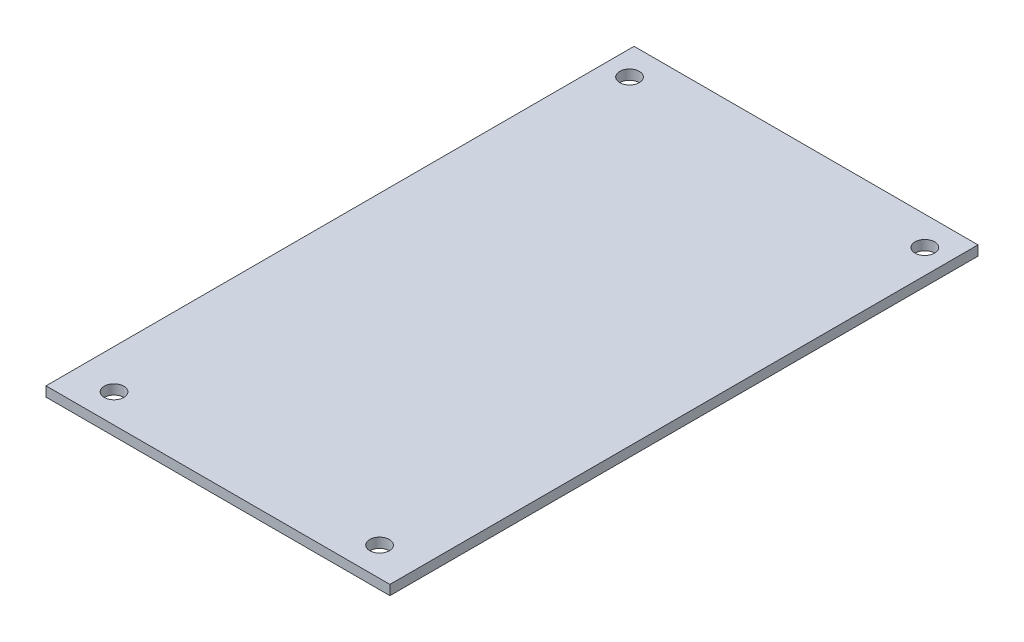
ISO-10303-21;
HEADER;
FILE_DESCRIPTION(('STEP AP214'),'2;1');
FILE_NAME('part.step','',(''),(''),'','','');
FILE_SCHEMA(('AUTOMOTIVE_DESIGN { 1 0 10303 214 1 1 1 1 }'));
ENDSEC;
DATA;
#1=APPLICATION_CONTEXT('core data for automotive mechanical design processes');
#2=APPLICATION_PROTOCOL_DEFINITION('international standard','automotive_design',2000,#1);
#3=PRODUCT_CONTEXT('',#1,'mechanical');
#4=PRODUCT('Part','Part','',(#3));
#5=PRODUCT_RELATED_PRODUCT_CATEGORY('part','',(#4));
#6=PRODUCT_DEFINITION_FORMATION('','',#4);
#7=PRODUCT_DEFINITION_CONTEXT('part definition',#1,'design');
#8=PRODUCT_DEFINITION('design','',#6,#7);
#9=PRODUCT_DEFINITION_SHAPE('','',#8);
#10=(LENGTH_UNIT() NAMED_UNIT(*) SI_UNIT(.MILLI.,.METRE.));
#11=(NAMED_UNIT(*) PLANE_ANGLE_UNIT() SI_UNIT($,.RADIAN.));
#12=(NAMED_UNIT(*) SI_UNIT($,.STERADIAN.) SOLID_ANGLE_UNIT());
#13=UNCERTAINTY_MEASURE_WITH_UNIT(LENGTH_MEASURE(1.E-05),#10,'distance_accuracy_value','');
#14=(GEOMETRIC_REPRESENTATION_CONTEXT(3) GLOBAL_UNCERTAINTY_ASSIGNED_CONTEXT((#13)) GLOBAL_UNIT_ASSIGNED_CONTEXT((#10,
#11,#12)) REPRESENTATION_CONTEXT('',''));
#15=CARTESIAN_POINT('',(0.,0.,0.));
#16=DIRECTION('',(0.,0.,1.));
#17=DIRECTION('',(1.,0.,0.));
#18=AXIS2_PLACEMENT_3D('',#15,#16,#17);
#19=CARTESIAN_POINT('',(0.,1.5875,0.));
#20=DIRECTION('',(1.,0.,0.));
#21=DIRECTION('',(0.,0.,-1.));
#22=AXIS2_PLACEMENT_3D('',#19,#20,#21);
#23=PLANE('',#22);
#24=DIRECTION('',(0.,0.,1.));
#25=VECTOR('',#24,1.);
#26=CARTESIAN_POINT('',(0.,0.,0.));
#27=LINE('',#26,#25);
#28=CARTESIAN_POINT('',(0.,0.,-95.25));
#29=VERTEX_POINT('',#28);
#30=CARTESIAN_POINT('',(0.,0.,0.));
#31=VERTEX_POINT('',#30);
#32=EDGE_CURVE('E96',#29,#31,#27,.T.);
#33=ORIENTED_EDGE('',*,*,#32,.T.);
#34=DIRECTION('',(0.,-1.,0.));
#35=VECTOR('',#34,1.);
#36=CARTESIAN_POINT('',(0.,1.5875,0.));
#37=LINE('',#36,#35);
#38=CARTESIAN_POINT('',(0.,1.5875,0.));
#39=VERTEX_POINT('',#38);
#40=EDGE_CURVE('E11',#39,#31,#37,.T.);
#41=ORIENTED_EDGE('',*,*,#40,.F.);
#42=DIRECTION('',(0.,0.,1.));
#43=VECTOR('',#42,1.);
#44=CARTESIAN_POINT('',(0.,1.5875,0.));
#45=LINE('',#44,#43);
#46=CARTESIAN_POINT('',(0.,1.5875,-95.25));
#47=VERTEX_POINT('',#46);
#48=EDGE_CURVE('E84',#47,#39,#45,.T.);
#49=ORIENTED_EDGE('',*,*,#48,.F.);
#50=DIRECTION('',(0.,-1.,0.));
#51=VECTOR('',#50,1.);
#52=CARTESIAN_POINT('',(0.,1.5875,-95.25));
#53=LINE('',#52,#51);
#54=EDGE_CURVE('E92',#47,#29,#53,.T.);
#55=ORIENTED_EDGE('',*,*,#54,.T.);
#56=EDGE_LOOP('',(#33,#41,#49,#55));
#57=FACE_BOUND('',#56,.T.);
#58=ADVANCED_FACE('F33',(#57),#23,.F.);
#59=CARTESIAN_POINT('',(0.,1.5875,0.));
#60=DIRECTION('',(0.,0.,-1.));
#61=DIRECTION('',(-1.,0.,0.));
#62=AXIS2_PLACEMENT_3D('',#59,#60,#61);
#63=PLANE('',#62);
#64=DIRECTION('',(1.,0.,0.));
#65=VECTOR('',#64,1.);
#66=CARTESIAN_POINT('',(0.,0.,0.));
#67=LINE('',#66,#65);
#68=CARTESIAN_POINT('',(55.7022,0.,0.));
#69=VERTEX_POINT('',#68);
#70=EDGE_CURVE('E88',#31,#69,#67,.T.);
#71=ORIENTED_EDGE('',*,*,#70,.T.);
#72=DIRECTION('',(0.,-1.,0.));
#73=VECTOR('',#72,1.);
#74=CARTESIAN_POINT('',(55.7022,1.5875,0.));
#75=LINE('',#74,#73);
#76=CARTESIAN_POINT('',(55.7022,1.5875,0.));
#77=VERTEX_POINT('',#76);
#78=EDGE_CURVE('E41',#77,#69,#75,.T.);
#79=ORIENTED_EDGE('',*,*,#78,.F.);
#80=DIRECTION('',(1.,0.,0.));
#81=VECTOR('',#80,1.);
#82=CARTESIAN_POINT('',(0.,1.5875,0.));
#83=LINE('',#82,#81);
#84=EDGE_CURVE('E79',#39,#77,#83,.T.);
#85=ORIENTED_EDGE('',*,*,#84,.F.);
#86=ORIENTED_EDGE('',*,*,#40,.T.);
#87=EDGE_LOOP('',(#71,#79,#85,#86));
#88=FACE_BOUND('',#87,.T.);
#89=ADVANCED_FACE('F87',(#88),#63,.F.);
#90=CARTESIAN_POINT('',(55.7022,1.5875,0.));
#91=DIRECTION('',(-1.,0.,0.));
#92=DIRECTION('',(0.,0.,1.));
#93=AXIS2_PLACEMENT_3D('',#90,#91,#92);
#94=PLANE('',#93);
#95=DIRECTION('',(0.,0.,-1.));
#96=VECTOR('',#95,1.);
#97=CARTESIAN_POINT('',(55.7022,0.,0.));
#98=LINE('',#97,#96);
#99=CARTESIAN_POINT('',(55.7022,0.,-95.25));
#100=VERTEX_POINT('',#99);
#101=EDGE_CURVE('E66',#69,#100,#98,.T.);
#102=ORIENTED_EDGE('',*,*,#101,.T.);
#103=DIRECTION('',(0.,-1.,0.));
#104=VECTOR('',#103,1.);
#105=CARTESIAN_POINT('',(55.7022,1.5875,-95.25));
#106=LINE('',#105,#104);
#107=CARTESIAN_POINT('',(55.7022,1.5875,-95.25));
#108=VERTEX_POINT('',#107);
#109=EDGE_CURVE('E89',#108,#100,#106,.T.);
#110=ORIENTED_EDGE('',*,*,#109,.F.);
#111=DIRECTION('',(0.,0.,-1.));
#112=VECTOR('',#111,1.);
#113=CARTESIAN_POINT('',(55.7022,1.5875,0.));
#114=LINE('',#113,#112);
#115=EDGE_CURVE('E82',#77,#108,#114,.T.);
#116=ORIENTED_EDGE('',*,*,#115,.F.);
#117=ORIENTED_EDGE('',*,*,#78,.T.);
#118=EDGE_LOOP('',(#102,#110,#116,#117));
#119=FACE_BOUND('',#118,.T.);
#120=ADVANCED_FACE('F90',(#119),#94,.F.);
#121=CARTESIAN_POINT('',(0.,1.5875,-95.25));
#122=DIRECTION('',(0.,0.,1.));
#123=DIRECTION('',(1.,0.,0.));
#124=AXIS2_PLACEMENT_3D('',#121,#122,#123);
#125=PLANE('',#124);
#126=DIRECTION('',(-1.,0.,0.));
#127=VECTOR('',#126,1.);
#128=CARTESIAN_POINT('',(0.,0.,-95.25));
#129=LINE('',#128,#127);
#130=EDGE_CURVE('E72',#100,#29,#129,.T.);
#131=ORIENTED_EDGE('',*,*,#130,.T.);
#132=ORIENTED_EDGE('',*,*,#54,.F.);
#133=DIRECTION('',(-1.,0.,0.));
#134=VECTOR('',#133,1.);
#135=CARTESIAN_POINT('',(0.,1.5875,-95.25));
#136=LINE('',#135,#134);
#137=EDGE_CURVE('E49',#108,#47,#136,.T.);
#138=ORIENTED_EDGE('',*,*,#137,.F.);
#139=ORIENTED_EDGE('',*,*,#109,.T.);
#140=EDGE_LOOP('',(#131,#132,#138,#139));
#141=FACE_BOUND('',#140,.T.);
#142=ADVANCED_FACE('F104',(#141),#125,.F.);
#143=CARTESIAN_POINT('',(0.,1.5875,0.));
#144=DIRECTION('',(0.,-1.,0.));
#145=DIRECTION('',(0.,0.,-1.));
#146=AXIS2_PLACEMENT_3D('',#143,#144,#145);
#147=PLANE('',#146);
#148=CARTESIAN_POINT('',(51.7652,1.5875,-90.5764));
#149=DIRECTION('',(0.,1.,0.));
#150=DIRECTION('',(0.,0.,1.));
#151=AXIS2_PLACEMENT_3D('',#148,#149,#150);
#152=CIRCLE('',#151,1.5875);
#153=CARTESIAN_POINT('',(51.7652,1.5875,-88.9889));
#154=VERTEX_POINT('',#153);
#155=EDGE_CURVE('E123',#154,#154,#152,.T.);
#156=ORIENTED_EDGE('',*,*,#155,.F.);
#157=EDGE_LOOP('',(#156));
#158=FACE_BOUND('',#157,.T.);
#159=CARTESIAN_POINT('',(6.35,1.5875,-4.6736));
#160=DIRECTION('',(0.,1.,0.));
#161=DIRECTION('',(0.,0.,1.));
#162=AXIS2_PLACEMENT_3D('',#159,#160,#161);
#163=CIRCLE('',#162,1.5875);
#164=CARTESIAN_POINT('',(6.35,1.5875,-3.0861));
#165=VERTEX_POINT('',#164);
#166=EDGE_CURVE('E116',#165,#165,#163,.T.);
#167=ORIENTED_EDGE('',*,*,#166,.F.);
#168=EDGE_LOOP('',(#167));
#169=FACE_BOUND('',#168,.T.);
#170=CARTESIAN_POINT('',(49.3522,1.5875,-4.6736));
#171=DIRECTION('',(0.,1.,0.));
#172=DIRECTION('',(0.,0.,1.));
#173=AXIS2_PLACEMENT_3D('',#170,#171,#172);
#174=CIRCLE('',#173,1.5875);
#175=CARTESIAN_POINT('',(49.3522,1.5875,-3.08610000000001));
#176=VERTEX_POINT('',#175);
#177=EDGE_CURVE('E128',#176,#176,#174,.T.);
#178=ORIENTED_EDGE('',*,*,#177,.F.);
#179=EDGE_LOOP('',(#178));
#180=FACE_BOUND('',#179,.T.);
#181=CARTESIAN_POINT('',(3.937,1.5875,-90.5764));
#182=DIRECTION('',(0.,1.,0.));
#183=DIRECTION('',(0.,0.,1.));
#184=AXIS2_PLACEMENT_3D('',#181,#182,#183);
#185=CIRCLE('',#184,1.5875);
#186=CARTESIAN_POINT('',(3.937,1.5875,-88.9889));
#187=VERTEX_POINT('',#186);
#188=EDGE_CURVE('E110',#187,#187,#185,.T.);
#189=ORIENTED_EDGE('',*,*,#188,.F.);
#190=EDGE_LOOP('',(#189));
#191=FACE_BOUND('',#190,.T.);
#192=ORIENTED_EDGE('',*,*,#48,.T.);
#193=ORIENTED_EDGE('',*,*,#84,.T.);
#194=ORIENTED_EDGE('',*,*,#115,.T.);
#195=ORIENTED_EDGE('',*,*,#137,.T.);
#196=EDGE_LOOP('',(#192,#193,#194,#195));
#197=FACE_BOUND('',#196,.T.);
#198=ADVANCED_FACE('F80',(#158,#169,#180,#191,#197),#147,.F.);
#199=CARTESIAN_POINT('',(0.,0.,0.));
#200=DIRECTION('',(0.,-1.,0.));
#201=DIRECTION('',(0.,0.,-1.));
#202=AXIS2_PLACEMENT_3D('',#199,#200,#201);
#203=PLANE('',#202);
#204=CARTESIAN_POINT('',(51.7652,0.,-90.5764));
#205=DIRECTION('',(0.,1.,0.));
#206=DIRECTION('',(0.,0.,1.));
#207=AXIS2_PLACEMENT_3D('',#204,#205,#206);
#208=CIRCLE('',#207,1.5875);
#209=CARTESIAN_POINT('',(51.7652,0.,-88.9889));
#210=VERTEX_POINT('',#209);
#211=EDGE_CURVE('E113',#210,#210,#208,.T.);
#212=ORIENTED_EDGE('',*,*,#211,.T.);
#213=EDGE_LOOP('',(#212));
#214=FACE_BOUND('',#213,.T.);
#215=CARTESIAN_POINT('',(6.35,0.,-4.6736));
#216=DIRECTION('',(0.,1.,0.));
#217=DIRECTION('',(0.,0.,1.));
#218=AXIS2_PLACEMENT_3D('',#215,#216,#217);
#219=CIRCLE('',#218,1.5875);
#220=CARTESIAN_POINT('',(6.35,0.,-3.0861));
#221=VERTEX_POINT('',#220);
#222=EDGE_CURVE('E119',#221,#221,#219,.T.);
#223=ORIENTED_EDGE('',*,*,#222,.T.);
#224=EDGE_LOOP('',(#223));
#225=FACE_BOUND('',#224,.T.);
#226=CARTESIAN_POINT('',(49.3522,0.,-4.6736));
#227=DIRECTION('',(0.,1.,0.));
#228=DIRECTION('',(0.,0.,1.));
#229=AXIS2_PLACEMENT_3D('',#226,#227,#228);
#230=CIRCLE('',#229,1.5875);
#231=CARTESIAN_POINT('',(49.3522,0.,-3.08610000000001));
#232=VERTEX_POINT('',#231);
#233=EDGE_CURVE('E120',#232,#232,#230,.T.);
#234=ORIENTED_EDGE('',*,*,#233,.T.);
#235=EDGE_LOOP('',(#234));
#236=FACE_BOUND('',#235,.T.);
#237=CARTESIAN_POINT('',(3.937,0.,-90.5764));
#238=DIRECTION('',(0.,1.,0.));
#239=DIRECTION('',(0.,0.,1.));
#240=AXIS2_PLACEMENT_3D('',#237,#238,#239);
#241=CIRCLE('',#240,1.5875);
#242=CARTESIAN_POINT('',(3.937,0.,-88.9889));
#243=VERTEX_POINT('',#242);
#244=EDGE_CURVE('E99',#243,#243,#241,.T.);
#245=ORIENTED_EDGE('',*,*,#244,.T.);
#246=EDGE_LOOP('',(#245));
#247=FACE_BOUND('',#246,.T.);
#248=ORIENTED_EDGE('',*,*,#32,.F.);
#249=ORIENTED_EDGE('',*,*,#130,.F.);
#250=ORIENTED_EDGE('',*,*,#101,.F.);
#251=ORIENTED_EDGE('',*,*,#70,.F.);
#252=EDGE_LOOP('',(#248,#249,#250,#251));
#253=FACE_BOUND('',#252,.T.);
#254=ADVANCED_FACE('F107',(#214,#225,#236,#247,#253),#203,.T.);
#255=CARTESIAN_POINT('',(3.937,0.,-90.5764));
#256=DIRECTION('',(0.,1.,0.));
#257=DIRECTION('',(0.,0.,1.));
#258=AXIS2_PLACEMENT_3D('',#255,#256,#257);
#259=CYLINDRICAL_SURFACE('',#258,1.5875);
#260=ORIENTED_EDGE('',*,*,#244,.F.);
#261=EDGE_LOOP('',(#260));
#262=FACE_BOUND('',#261,.T.);
#263=ORIENTED_EDGE('',*,*,#188,.T.);
#264=EDGE_LOOP('',(#263));
#265=FACE_BOUND('',#264,.T.);
#266=ADVANCED_FACE('F140',(#262,#265),#259,.F.);
#267=CARTESIAN_POINT('',(49.3522,0.,-4.6736));
#268=DIRECTION('',(0.,1.,0.));
#269=DIRECTION('',(0.,0.,1.));
#270=AXIS2_PLACEMENT_3D('',#267,#268,#269);
#271=CYLINDRICAL_SURFACE('',#270,1.5875);
#272=ORIENTED_EDGE('',*,*,#233,.F.);
#273=EDGE_LOOP('',(#272));
#274=FACE_BOUND('',#273,.T.);
#275=ORIENTED_EDGE('',*,*,#177,.T.);
#276=EDGE_LOOP('',(#275));
#277=FACE_BOUND('',#276,.T.);
#278=ADVANCED_FACE('F136',(#274,#277),#271,.F.);
#279=CARTESIAN_POINT('',(6.35,0.,-4.6736));
#280=DIRECTION('',(0.,1.,0.));
#281=DIRECTION('',(0.,0.,1.));
#282=AXIS2_PLACEMENT_3D('',#279,#280,#281);
#283=CYLINDRICAL_SURFACE('',#282,1.5875);
#284=ORIENTED_EDGE('',*,*,#222,.F.);
#285=EDGE_LOOP('',(#284));
#286=FACE_BOUND('',#285,.T.);
#287=ORIENTED_EDGE('',*,*,#166,.T.);
#288=EDGE_LOOP('',(#287));
#289=FACE_BOUND('',#288,.T.);
#290=ADVANCED_FACE('F139',(#286,#289),#283,.F.);
#291=CARTESIAN_POINT('',(51.7652,0.,-90.5764));
#292=DIRECTION('',(0.,1.,0.));
#293=DIRECTION('',(0.,0.,1.));
#294=AXIS2_PLACEMENT_3D('',#291,#292,#293);
#295=CYLINDRICAL_SURFACE('',#294,1.5875);
#296=ORIENTED_EDGE('',*,*,#211,.F.);
#297=EDGE_LOOP('',(#296));
#298=FACE_BOUND('',#297,.T.);
#299=ORIENTED_EDGE('',*,*,#155,.T.);
#300=EDGE_LOOP('',(#299));
#301=FACE_BOUND('',#300,.T.);
#302=ADVANCED_FACE('F201',(#298,#301),#295,.F.);
#303=CLOSED_SHELL('',(#58,#89,#120,#142,#198,#254,#266,#278,#290,#302));
#304=MANIFOLD_SOLID_BREP('B2',#303);
#305=ADVANCED_BREP_SHAPE_REPRESENTATION('',(#18,#304),#14);
#306=SHAPE_DEFINITION_REPRESENTATION(#9,#305);
ENDSEC;
END-ISO-10303-21;
